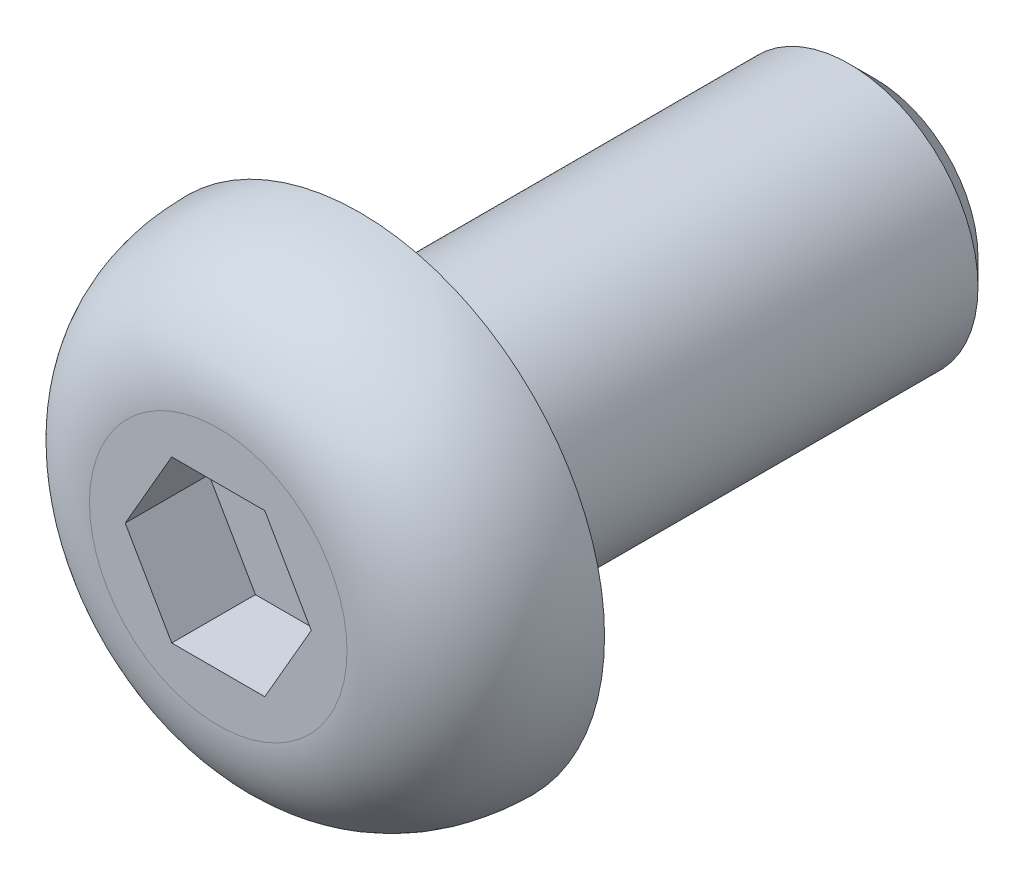
ISO-10303-21;
HEADER;
FILE_DESCRIPTION(('STEP AP214'),'2;1');
FILE_NAME('part.step','',(''),(''),'','','');
FILE_SCHEMA(('AUTOMOTIVE_DESIGN { 1 0 10303 214 1 1 1 1 }'));
ENDSEC;
DATA;
#1=APPLICATION_CONTEXT('core data for automotive mechanical design processes');
#2=APPLICATION_PROTOCOL_DEFINITION('international standard','automotive_design',2000,#1);
#3=PRODUCT_CONTEXT('',#1,'mechanical');
#4=PRODUCT('Part','Part','',(#3));
#5=PRODUCT_RELATED_PRODUCT_CATEGORY('part','',(#4));
#6=PRODUCT_DEFINITION_FORMATION('','',#4);
#7=PRODUCT_DEFINITION_CONTEXT('part definition',#1,'design');
#8=PRODUCT_DEFINITION('design','',#6,#7);
#9=PRODUCT_DEFINITION_SHAPE('','',#8);
#10=(LENGTH_UNIT() NAMED_UNIT(*) SI_UNIT(.MILLI.,.METRE.));
#11=(NAMED_UNIT(*) PLANE_ANGLE_UNIT() SI_UNIT($,.RADIAN.));
#12=(NAMED_UNIT(*) SI_UNIT($,.STERADIAN.) SOLID_ANGLE_UNIT());
#13=UNCERTAINTY_MEASURE_WITH_UNIT(LENGTH_MEASURE(1.E-05),#10,'distance_accuracy_value','');
#14=(GEOMETRIC_REPRESENTATION_CONTEXT(3) GLOBAL_UNCERTAINTY_ASSIGNED_CONTEXT((#13)) GLOBAL_UNIT_ASSIGNED_CONTEXT((#10,
#11,#12)) REPRESENTATION_CONTEXT('',''));
#15=CARTESIAN_POINT('',(0.,0.,0.));
#16=DIRECTION('',(0.,0.,1.));
#17=DIRECTION('',(1.,0.,0.));
#18=AXIS2_PLACEMENT_3D('',#15,#16,#17);
#19=CARTESIAN_POINT('',(0.,0.,0.9));
#20=DIRECTION('',(0.,0.,1.));
#21=DIRECTION('',(1.,0.,0.));
#22=AXIS2_PLACEMENT_3D('',#19,#20,#21);
#23=PLANE('',#22);
#24=DIRECTION('',(-1.,0.,0.));
#25=VECTOR('',#24,1.);
#26=CARTESIAN_POINT('',(-0.7225,-1.251406708469,0.9));
#27=LINE('',#26,#25);
#28=CARTESIAN_POINT('',(0.7225,-1.251406708469,0.9));
#29=VERTEX_POINT('',#28);
#30=CARTESIAN_POINT('',(-0.722499999999879,-1.25140670846893,0.9));
#31=VERTEX_POINT('',#30);
#32=EDGE_CURVE('E72',#29,#31,#27,.T.);
#33=ORIENTED_EDGE('',*,*,#32,.F.);
#34=DIRECTION('',(-0.50000000000019,-0.866025403784329,0.));
#35=VECTOR('',#34,1.);
#36=CARTESIAN_POINT('',(0.7225,-1.251406708469,0.9));
#37=LINE('',#36,#35);
#38=CARTESIAN_POINT('',(1.44500000000012,0.,0.9));
#39=VERTEX_POINT('',#38);
#40=EDGE_CURVE('E128',#39,#29,#37,.T.);
#41=ORIENTED_EDGE('',*,*,#40,.F.);
#42=DIRECTION('',(0.50000000000019,-0.866025403784329,0.));
#43=VECTOR('',#42,1.);
#44=CARTESIAN_POINT('',(1.445,0.,0.9));
#45=LINE('',#44,#43);
#46=CARTESIAN_POINT('',(0.722499999999879,1.25140670846893,0.9));
#47=VERTEX_POINT('',#46);
#48=EDGE_CURVE('E290',#47,#39,#45,.T.);
#49=ORIENTED_EDGE('',*,*,#48,.F.);
#50=DIRECTION('',(1.,0.,0.));
#51=VECTOR('',#50,1.);
#52=CARTESIAN_POINT('',(0.7225,1.251406708469,0.9));
#53=LINE('',#52,#51);
#54=CARTESIAN_POINT('',(-0.7225,1.251406708469,0.9));
#55=VERTEX_POINT('',#54);
#56=EDGE_CURVE('E285',#55,#47,#53,.T.);
#57=ORIENTED_EDGE('',*,*,#56,.F.);
#58=DIRECTION('',(0.50000000000019,0.866025403784329,0.));
#59=VECTOR('',#58,1.);
#60=CARTESIAN_POINT('',(-0.7225,1.251406708469,0.9));
#61=LINE('',#60,#59);
#62=CARTESIAN_POINT('',(-1.44500000000012,0.,0.9));
#63=VERTEX_POINT('',#62);
#64=EDGE_CURVE('E83',#63,#55,#61,.T.);
#65=ORIENTED_EDGE('',*,*,#64,.F.);
#66=DIRECTION('',(-0.50000000000019,0.866025403784329,0.));
#67=VECTOR('',#66,1.);
#68=CARTESIAN_POINT('',(-1.445,0.,0.9));
#69=LINE('',#68,#67);
#70=EDGE_CURVE('E67',#31,#63,#69,.T.);
#71=ORIENTED_EDGE('',*,*,#70,.F.);
#72=EDGE_LOOP('',(#33,#41,#49,#57,#65,#71));
#73=FACE_BOUND('',#72,.T.);
#74=ADVANCED_FACE('F17',(#73),#23,.T.);
#75=CARTESIAN_POINT('',(-0.7225,-1.251406708469,0.9));
#76=DIRECTION('',(0.,1.,0.));
#77=DIRECTION('',(-1.,0.,0.));
#78=AXIS2_PLACEMENT_3D('',#75,#76,#77);
#79=PLANE('',#78);
#80=DIRECTION('',(0.,0.,1.));
#81=VECTOR('',#80,1.);
#82=CARTESIAN_POINT('',(0.7225,-1.251406708469,0.9));
#83=LINE('',#82,#81);
#84=CARTESIAN_POINT('',(0.7225,-1.251406708469,2.2));
#85=VERTEX_POINT('',#84);
#86=EDGE_CURVE('E77',#29,#85,#83,.T.);
#87=ORIENTED_EDGE('',*,*,#86,.F.);
#88=ORIENTED_EDGE('',*,*,#32,.T.);
#89=DIRECTION('',(0.,0.,1.));
#90=VECTOR('',#89,1.);
#91=CARTESIAN_POINT('',(-0.722499999999515,-1.25140670846872,0.9));
#92=LINE('',#91,#90);
#93=CARTESIAN_POINT('',(-0.722499999999879,-1.25140670846893,2.2));
#94=VERTEX_POINT('',#93);
#95=EDGE_CURVE('E74',#94,#31,#92,.F.);
#96=ORIENTED_EDGE('',*,*,#95,.F.);
#97=DIRECTION('',(1.,0.,0.));
#98=VECTOR('',#97,1.);
#99=CARTESIAN_POINT('',(0.,-1.251406708469,2.2));
#100=LINE('',#99,#98);
#101=EDGE_CURVE('E126',#85,#94,#100,.F.);
#102=ORIENTED_EDGE('',*,*,#101,.F.);
#103=EDGE_LOOP('',(#87,#88,#96,#102));
#104=FACE_BOUND('',#103,.T.);
#105=ADVANCED_FACE('F73',(#104),#79,.T.);
#106=CARTESIAN_POINT('',(-1.445,0.,0.9));
#107=DIRECTION('',(0.866025403784329,0.50000000000019,0.));
#108=DIRECTION('',(-0.50000000000019,0.866025403784329,0.));
#109=AXIS2_PLACEMENT_3D('',#106,#107,#108);
#110=PLANE('',#109);
#111=ORIENTED_EDGE('',*,*,#95,.T.);
#112=ORIENTED_EDGE('',*,*,#70,.T.);
#113=DIRECTION('',(0.,0.,1.));
#114=VECTOR('',#113,1.);
#115=CARTESIAN_POINT('',(-1.44500000000049,2.7972416050126E-13,0.9));
#116=LINE('',#115,#114);
#117=CARTESIAN_POINT('',(-1.44500000000012,0.,2.2));
#118=VERTEX_POINT('',#117);
#119=EDGE_CURVE('E85',#118,#63,#116,.F.);
#120=ORIENTED_EDGE('',*,*,#119,.F.);
#121=DIRECTION('',(-0.499999999999854,0.866025403784523,0.));
#122=VECTOR('',#121,1.);
#123=CARTESIAN_POINT('',(-0.7225,-1.251406708469,2.2));
#124=LINE('',#123,#122);
#125=EDGE_CURVE('E89',#94,#118,#124,.T.);
#126=ORIENTED_EDGE('',*,*,#125,.F.);
#127=EDGE_LOOP('',(#111,#112,#120,#126));
#128=FACE_BOUND('',#127,.T.);
#129=ADVANCED_FACE('F87',(#128),#110,.T.);
#130=CARTESIAN_POINT('',(-0.7225,1.251406708469,0.9));
#131=DIRECTION('',(0.866025403784329,-0.50000000000019,0.));
#132=DIRECTION('',(0.50000000000019,0.866025403784329,0.));
#133=AXIS2_PLACEMENT_3D('',#130,#131,#132);
#134=PLANE('',#133);
#135=ORIENTED_EDGE('',*,*,#119,.T.);
#136=ORIENTED_EDGE('',*,*,#64,.T.);
#137=DIRECTION('',(0.,0.,1.));
#138=VECTOR('',#137,1.);
#139=CARTESIAN_POINT('',(-0.7225,1.251406708469,0.9));
#140=LINE('',#139,#138);
#141=CARTESIAN_POINT('',(-0.7225,1.251406708469,2.2));
#142=VERTEX_POINT('',#141);
#143=EDGE_CURVE('E280',#142,#55,#140,.F.);
#144=ORIENTED_EDGE('',*,*,#143,.F.);
#145=DIRECTION('',(0.499999999999854,0.866025403784523,0.));
#146=VECTOR('',#145,1.);
#147=CARTESIAN_POINT('',(-1.445,0.,2.2));
#148=LINE('',#147,#146);
#149=EDGE_CURVE('E122',#118,#142,#148,.T.);
#150=ORIENTED_EDGE('',*,*,#149,.F.);
#151=EDGE_LOOP('',(#135,#136,#144,#150));
#152=FACE_BOUND('',#151,.T.);
#153=ADVANCED_FACE('F172',(#152),#134,.T.);
#154=CARTESIAN_POINT('',(0.7225,1.251406708469,0.9));
#155=DIRECTION('',(0.,-1.,0.));
#156=DIRECTION('',(1.,0.,0.));
#157=AXIS2_PLACEMENT_3D('',#154,#155,#156);
#158=PLANE('',#157);
#159=ORIENTED_EDGE('',*,*,#143,.T.);
#160=ORIENTED_EDGE('',*,*,#56,.T.);
#161=DIRECTION('',(0.,0.,1.));
#162=VECTOR('',#161,1.);
#163=CARTESIAN_POINT('',(0.722499999999515,1.25140670846872,0.9));
#164=LINE('',#163,#162);
#165=CARTESIAN_POINT('',(0.722499999999879,1.25140670846893,2.2));
#166=VERTEX_POINT('',#165);
#167=EDGE_CURVE('E287',#166,#47,#164,.F.);
#168=ORIENTED_EDGE('',*,*,#167,.F.);
#169=DIRECTION('',(1.,0.,0.));
#170=VECTOR('',#169,1.);
#171=CARTESIAN_POINT('',(0.,1.251406708469,2.2));
#172=LINE('',#171,#170);
#173=EDGE_CURVE('E113',#142,#166,#172,.T.);
#174=ORIENTED_EDGE('',*,*,#173,.F.);
#175=EDGE_LOOP('',(#159,#160,#168,#174));
#176=FACE_BOUND('',#175,.T.);
#177=ADVANCED_FACE('F169',(#176),#158,.T.);
#178=CARTESIAN_POINT('',(1.445,0.,0.9));
#179=DIRECTION('',(-0.866025403784329,-0.50000000000019,0.));
#180=DIRECTION('',(0.50000000000019,-0.866025403784329,0.));
#181=AXIS2_PLACEMENT_3D('',#178,#179,#180);
#182=PLANE('',#181);
#183=ORIENTED_EDGE('',*,*,#167,.T.);
#184=ORIENTED_EDGE('',*,*,#48,.T.);
#185=DIRECTION('',(0.,0.,1.));
#186=VECTOR('',#185,1.);
#187=CARTESIAN_POINT('',(1.44500000000049,-2.7972416050126E-13,0.9));
#188=LINE('',#187,#186);
#189=CARTESIAN_POINT('',(1.44500000000012,0.,2.2));
#190=VERTEX_POINT('',#189);
#191=EDGE_CURVE('E35',#190,#39,#188,.F.);
#192=ORIENTED_EDGE('',*,*,#191,.F.);
#193=DIRECTION('',(0.499999999999854,-0.866025403784523,0.));
#194=VECTOR('',#193,1.);
#195=CARTESIAN_POINT('',(0.7225,1.251406708469,2.2));
#196=LINE('',#195,#194);
#197=EDGE_CURVE('E109',#166,#190,#196,.T.);
#198=ORIENTED_EDGE('',*,*,#197,.F.);
#199=EDGE_LOOP('',(#183,#184,#192,#198));
#200=FACE_BOUND('',#199,.T.);
#201=ADVANCED_FACE('F165',(#200),#182,.T.);
#202=CARTESIAN_POINT('',(0.7225,-1.251406708469,0.9));
#203=DIRECTION('',(-0.866025403784329,0.50000000000019,0.));
#204=DIRECTION('',(-0.50000000000019,-0.866025403784329,0.));
#205=AXIS2_PLACEMENT_3D('',#202,#203,#204);
#206=PLANE('',#205);
#207=ORIENTED_EDGE('',*,*,#191,.T.);
#208=ORIENTED_EDGE('',*,*,#40,.T.);
#209=ORIENTED_EDGE('',*,*,#86,.T.);
#210=DIRECTION('',(-0.499999999999854,-0.866025403784523,0.));
#211=VECTOR('',#210,1.);
#212=CARTESIAN_POINT('',(1.445,0.,2.2));
#213=LINE('',#212,#211);
#214=EDGE_CURVE('E104',#190,#85,#213,.T.);
#215=ORIENTED_EDGE('',*,*,#214,.F.);
#216=EDGE_LOOP('',(#207,#208,#209,#215));
#217=FACE_BOUND('',#216,.T.);
#218=ADVANCED_FACE('F162',(#217),#206,.T.);
#219=CARTESIAN_POINT('',(0.,0.,2.2));
#220=DIRECTION('',(0.,0.,1.));
#221=DIRECTION('',(1.,0.,0.));
#222=AXIS2_PLACEMENT_3D('',#219,#220,#221);
#223=PLANE('',#222);
#224=ORIENTED_EDGE('',*,*,#197,.T.);
#225=ORIENTED_EDGE('',*,*,#214,.T.);
#226=ORIENTED_EDGE('',*,*,#101,.T.);
#227=ORIENTED_EDGE('',*,*,#125,.T.);
#228=ORIENTED_EDGE('',*,*,#149,.T.);
#229=ORIENTED_EDGE('',*,*,#173,.T.);
#230=EDGE_LOOP('',(#224,#225,#226,#227,#228,#229));
#231=FACE_BOUND('',#230,.T.);
#232=CARTESIAN_POINT('',(0.,0.,2.2));
#233=DIRECTION('',(0.,0.,-1.));
#234=DIRECTION('',(1.,0.,0.));
#235=AXIS2_PLACEMENT_3D('',#232,#233,#234);
#236=CIRCLE('',#235,2.);
#237=CARTESIAN_POINT('',(2.,0.,2.2));
#238=VERTEX_POINT('',#237);
#239=EDGE_CURVE('E100',#238,#238,#236,.F.);
#240=ORIENTED_EDGE('',*,*,#239,.T.);
#241=EDGE_LOOP('',(#240));
#242=FACE_BOUND('',#241,.T.);
#243=ADVANCED_FACE('F157',(#231,#242),#223,.T.);
#244=CARTESIAN_POINT('',(0.,0.,-8.));
#245=DIRECTION('',(0.,0.,1.));
#246=DIRECTION('',(1.,0.,0.));
#247=AXIS2_PLACEMENT_3D('',#244,#245,#246);
#248=PLANE('',#247);
#249=CARTESIAN_POINT('',(0.,0.,-7.99999999998136));
#250=DIRECTION('',(0.,0.,1.));
#251=DIRECTION('',(1.,0.,0.));
#252=AXIS2_PLACEMENT_3D('',#249,#250,#251);
#253=CIRCLE('',#252,1.60000000005311);
#254=CARTESIAN_POINT('',(1.60000000005311,0.,-7.99999999998136));
#255=VERTEX_POINT('',#254);
#256=EDGE_CURVE('E20',#255,#255,#253,.T.);
#257=ORIENTED_EDGE('',*,*,#256,.F.);
#258=EDGE_LOOP('',(#257));
#259=FACE_BOUND('',#258,.T.);
#260=ADVANCED_FACE('F148',(#259),#248,.F.);
#261=CARTESIAN_POINT('',(2.,0.,2.2));
#262=CARTESIAN_POINT('',(2.878738,0.,2.189931));
#263=CARTESIAN_POINT('',(3.789818,0.,1.471707));
#264=CARTESIAN_POINT('',(3.8,0.,0.));
#265=(BOUNDED_CURVE() B_SPLINE_CURVE(3,(#261,#262,#263,#264),.UNSPECIFIED.,.F.,
.F.) B_SPLINE_CURVE_WITH_KNOTS((4,4),(0.,1.),
.UNSPECIFIED.) CURVE() GEOMETRIC_REPRESENTATION_ITEM() RATIONAL_B_SPLINE_CURVE((1.,1.,1.,1.)) REPRESENTATION_ITEM(''));
#266=CARTESIAN_POINT('',(0.,0.,0.));
#267=DIRECTION('',(0.,0.,-1.));
#268=AXIS1_PLACEMENT('',#266,#267);
#269=SURFACE_OF_REVOLUTION('',#265,#268);
#270=CARTESIAN_POINT('',(0.,0.,0.));
#271=DIRECTION('',(0.,0.,-1.));
#272=DIRECTION('',(-1.,0.,0.));
#273=AXIS2_PLACEMENT_3D('',#270,#271,#272);
#274=CIRCLE('',#273,3.8);
#275=CARTESIAN_POINT('',(-3.8,0.,0.));
#276=VERTEX_POINT('',#275);
#277=EDGE_CURVE('E93',#276,#276,#274,.F.);
#278=ORIENTED_EDGE('',*,*,#277,.T.);
#279=EDGE_LOOP('',(#278));
#280=FACE_BOUND('',#279,.T.);
#281=ORIENTED_EDGE('',*,*,#239,.F.);
#282=EDGE_LOOP('',(#281));
#283=FACE_BOUND('',#282,.T.);
#284=ADVANCED_FACE('F136',(#280,#283),#269,.T.);
#285=CARTESIAN_POINT('',(0.,0.,-7.60000000008176));
#286=DIRECTION('',(0.,0.,1.));
#287=DIRECTION('',(1.,0.,0.));
#288=AXIS2_PLACEMENT_3D('',#285,#286,#287);
#289=CONICAL_SURFACE('',#288,1.99999999995271,0.785398163397448);
#290=CARTESIAN_POINT('',(0.,0.,-7.6));
#291=DIRECTION('',(0.,0.,1.));
#292=DIRECTION('',(1.,0.,0.));
#293=AXIS2_PLACEMENT_3D('',#290,#291,#292);
#294=CIRCLE('',#293,2.);
#295=CARTESIAN_POINT('',(2.,0.,-7.6));
#296=VERTEX_POINT('',#295);
#297=EDGE_CURVE('E26',#296,#296,#294,.T.);
#298=ORIENTED_EDGE('',*,*,#297,.F.);
#299=EDGE_LOOP('',(#298));
#300=FACE_BOUND('',#299,.T.);
#301=ORIENTED_EDGE('',*,*,#256,.T.);
#302=EDGE_LOOP('',(#301));
#303=FACE_BOUND('',#302,.T.);
#304=ADVANCED_FACE('F147',(#300,#303),#289,.T.);
#305=CARTESIAN_POINT('',(0.,0.,0.));
#306=DIRECTION('',(0.,0.,1.));
#307=DIRECTION('',(1.,0.,0.));
#308=AXIS2_PLACEMENT_3D('',#305,#306,#307);
#309=PLANE('',#308);
#310=ORIENTED_EDGE('',*,*,#277,.F.);
#311=EDGE_LOOP('',(#310));
#312=FACE_BOUND('',#311,.T.);
#313=CARTESIAN_POINT('',(0.,0.,0.));
#314=DIRECTION('',(0.,0.,1.));
#315=DIRECTION('',(1.,0.,0.));
#316=AXIS2_PLACEMENT_3D('',#313,#314,#315);
#317=CIRCLE('',#316,2.);
#318=CARTESIAN_POINT('',(2.,0.,0.));
#319=VERTEX_POINT('',#318);
#320=EDGE_CURVE('E11',#319,#319,#317,.F.);
#321=ORIENTED_EDGE('',*,*,#320,.F.);
#322=EDGE_LOOP('',(#321));
#323=FACE_BOUND('',#322,.T.);
#324=ADVANCED_FACE('F185',(#312,#323),#309,.F.);
#325=CARTESIAN_POINT('',(0.,0.,-7.6));
#326=DIRECTION('',(0.,0.,1.));
#327=DIRECTION('',(1.,0.,0.));
#328=AXIS2_PLACEMENT_3D('',#325,#326,#327);
#329=CYLINDRICAL_SURFACE('',#328,2.);
#330=ORIENTED_EDGE('',*,*,#320,.T.);
#331=EDGE_LOOP('',(#330));
#332=FACE_BOUND('',#331,.T.);
#333=ORIENTED_EDGE('',*,*,#297,.T.);
#334=EDGE_LOOP('',(#333));
#335=FACE_BOUND('',#334,.T.);
#336=ADVANCED_FACE('F183',(#332,#335),#329,.T.);
#337=CLOSED_SHELL('',(#74,#105,#129,#153,#177,#201,#218,#243,#260,#284,#304,#324,#336));
#338=MANIFOLD_SOLID_BREP('B1',#337);
#339=ADVANCED_BREP_SHAPE_REPRESENTATION('',(#18,#338),#14);
#340=SHAPE_DEFINITION_REPRESENTATION(#9,#339);
ENDSEC;
END-ISO-10303-21;
